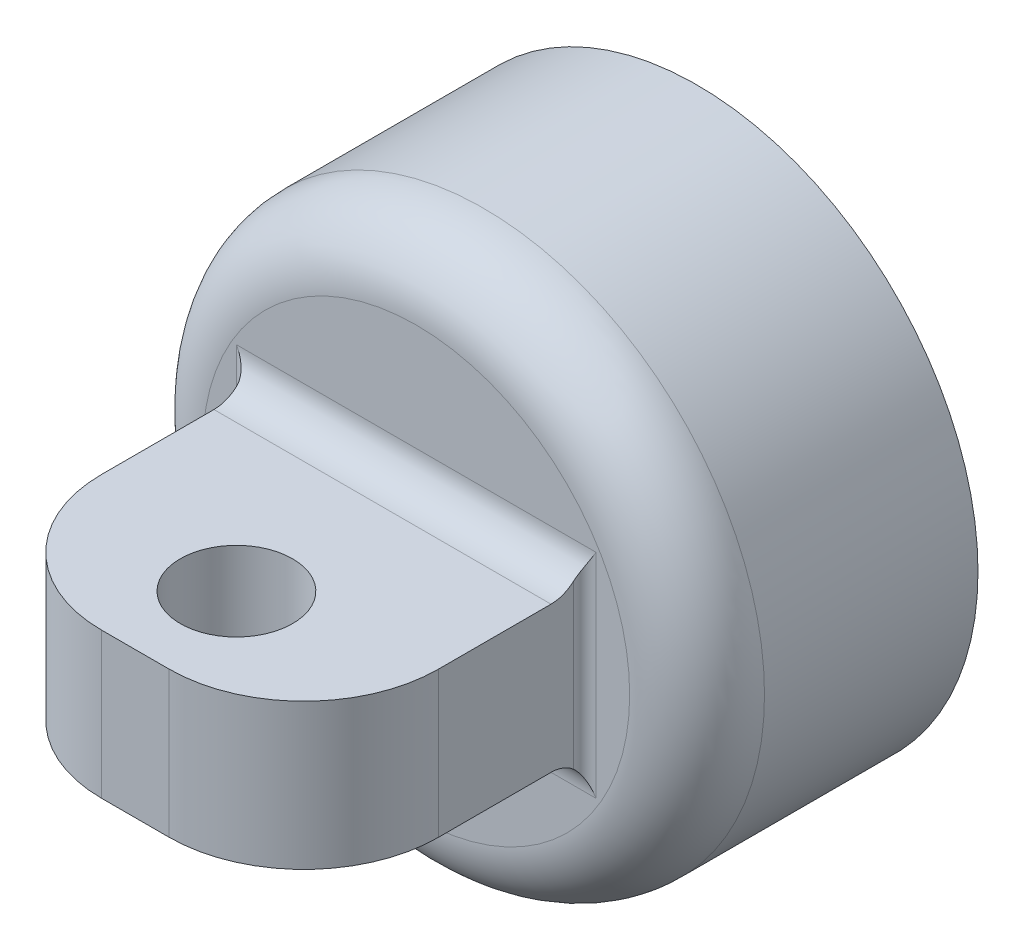
ISO-10303-21;
HEADER;
FILE_DESCRIPTION(('STEP AP214'),'2;1');
FILE_NAME('part.step','',(''),(''),'','','');
FILE_SCHEMA(('AUTOMOTIVE_DESIGN { 1 0 10303 214 1 1 1 1 }'));
ENDSEC;
DATA;
#1=APPLICATION_CONTEXT('core data for automotive mechanical design processes');
#2=APPLICATION_PROTOCOL_DEFINITION('international standard','automotive_design',2000,#1);
#3=PRODUCT_CONTEXT('',#1,'mechanical');
#4=PRODUCT('Part','Part','',(#3));
#5=PRODUCT_RELATED_PRODUCT_CATEGORY('part','',(#4));
#6=PRODUCT_DEFINITION_FORMATION('','',#4);
#7=PRODUCT_DEFINITION_CONTEXT('part definition',#1,'design');
#8=PRODUCT_DEFINITION('design','',#6,#7);
#9=PRODUCT_DEFINITION_SHAPE('','',#8);
#10=(LENGTH_UNIT() NAMED_UNIT(*) SI_UNIT(.MILLI.,.METRE.));
#11=(NAMED_UNIT(*) PLANE_ANGLE_UNIT() SI_UNIT($,.RADIAN.));
#12=(NAMED_UNIT(*) SI_UNIT($,.STERADIAN.) SOLID_ANGLE_UNIT());
#13=UNCERTAINTY_MEASURE_WITH_UNIT(LENGTH_MEASURE(1.E-05),#10,'distance_accuracy_value','');
#14=(GEOMETRIC_REPRESENTATION_CONTEXT(3) GLOBAL_UNCERTAINTY_ASSIGNED_CONTEXT((#13)) GLOBAL_UNIT_ASSIGNED_CONTEXT((#10,
#11,#12)) REPRESENTATION_CONTEXT('',''));
#15=CARTESIAN_POINT('',(0.,0.,0.));
#16=DIRECTION('',(0.,0.,1.));
#17=DIRECTION('',(1.,0.,0.));
#18=AXIS2_PLACEMENT_3D('',#15,#16,#17);
#19=CARTESIAN_POINT('',(0.,0.,25.));
#20=DIRECTION('',(0.,0.,-1.));
#21=DIRECTION('',(-1.,0.,0.));
#22=AXIS2_PLACEMENT_3D('',#19,#20,#21);
#23=CYLINDRICAL_SURFACE('',#22,25.);
#24=CARTESIAN_POINT('',(0.,0.,19.));
#25=DIRECTION('',(0.,0.,1.));
#26=DIRECTION('',(1.,0.,0.));
#27=AXIS2_PLACEMENT_3D('',#24,#25,#26);
#28=CIRCLE('',#27,25.);
#29=CARTESIAN_POINT('',(25.,0.,19.));
#30=VERTEX_POINT('',#29);
#31=EDGE_CURVE('E11',#30,#30,#28,.F.);
#32=ORIENTED_EDGE('',*,*,#31,.T.);
#33=EDGE_LOOP('',(#32));
#34=FACE_BOUND('',#33,.T.);
#35=CARTESIAN_POINT('',(0.,0.,0.));
#36=DIRECTION('',(0.,0.,1.));
#37=DIRECTION('',(1.,0.,0.));
#38=AXIS2_PLACEMENT_3D('',#35,#36,#37);
#39=CIRCLE('',#38,25.);
#40=CARTESIAN_POINT('',(25.,0.,0.));
#41=VERTEX_POINT('',#40);
#42=EDGE_CURVE('E156',#41,#41,#39,.T.);
#43=ORIENTED_EDGE('',*,*,#42,.T.);
#44=EDGE_LOOP('',(#43));
#45=FACE_BOUND('',#44,.T.);
#46=ADVANCED_FACE('F33',(#34,#45),#23,.T.);
#47=CARTESIAN_POINT('',(0.,0.,25.));
#48=DIRECTION('',(0.,0.,1.));
#49=DIRECTION('',(1.,0.,0.));
#50=AXIS2_PLACEMENT_3D('',#47,#48,#49);
#51=PLANE('',#50);
#52=CARTESIAN_POINT('',(0.,0.,25.));
#53=DIRECTION('',(0.,0.,1.));
#54=DIRECTION('',(1.,0.,0.));
#55=AXIS2_PLACEMENT_3D('',#52,#53,#54);
#56=CIRCLE('',#55,19.);
#57=CARTESIAN_POINT('',(19.,0.,25.));
#58=VERTEX_POINT('',#57);
#59=EDGE_CURVE('E41',#58,#58,#56,.T.);
#60=ORIENTED_EDGE('',*,*,#59,.T.);
#61=EDGE_LOOP('',(#60));
#62=FACE_BOUND('',#61,.T.);
#63=DIRECTION('',(0.,-1.,0.));
#64=VECTOR('',#63,1.);
#65=CARTESIAN_POINT('',(-16.,0.,25.));
#66=LINE('',#65,#64);
#67=CARTESIAN_POINT('',(-16.,-9.48210619073444,25.));
#68=VERTEX_POINT('',#67);
#69=CARTESIAN_POINT('',(-16.,9.48210619073444,25.));
#70=VERTEX_POINT('',#69);
#71=EDGE_CURVE('E169',#68,#70,#66,.F.);
#72=ORIENTED_EDGE('',*,*,#71,.T.);
#73=DIRECTION('',(-1.,0.,0.));
#74=VECTOR('',#73,1.);
#75=CARTESIAN_POINT('',(0.,9.48210619073444,25.));
#76=LINE('',#75,#74);
#77=CARTESIAN_POINT('',(16.,9.48210619073444,25.));
#78=VERTEX_POINT('',#77);
#79=EDGE_CURVE('E180',#70,#78,#76,.F.);
#80=ORIENTED_EDGE('',*,*,#79,.T.);
#81=DIRECTION('',(0.,1.,0.));
#82=VECTOR('',#81,1.);
#83=CARTESIAN_POINT('',(16.,0.,25.));
#84=LINE('',#83,#82);
#85=CARTESIAN_POINT('',(16.,-9.48210619073444,25.));
#86=VERTEX_POINT('',#85);
#87=EDGE_CURVE('E171',#78,#86,#84,.F.);
#88=ORIENTED_EDGE('',*,*,#87,.T.);
#89=DIRECTION('',(1.,0.,0.));
#90=VECTOR('',#89,1.);
#91=CARTESIAN_POINT('',(0.,-9.48210619073444,25.));
#92=LINE('',#91,#90);
#93=EDGE_CURVE('E177',#86,#68,#92,.F.);
#94=ORIENTED_EDGE('',*,*,#93,.T.);
#95=EDGE_LOOP('',(#72,#80,#88,#94));
#96=FACE_BOUND('',#95,.T.);
#97=ADVANCED_FACE('F231',(#62,#96),#51,.T.);
#98=CARTESIAN_POINT('',(0.,0.,0.));
#99=DIRECTION('',(0.,0.,1.));
#100=DIRECTION('',(1.,0.,0.));
#101=AXIS2_PLACEMENT_3D('',#98,#99,#100);
#102=PLANE('',#101);
#103=ORIENTED_EDGE('',*,*,#42,.F.);
#104=EDGE_LOOP('',(#103));
#105=FACE_BOUND('',#104,.T.);
#106=ADVANCED_FACE('F249',(#105),#102,.F.);
#107=CARTESIAN_POINT('',(15.,-6.48210619073444,50.));
#108=DIRECTION('',(-1.,0.,0.));
#109=DIRECTION('',(0.,0.,1.));
#110=AXIS2_PLACEMENT_3D('',#107,#108,#109);
#111=PLANE('',#110);
#112=DIRECTION('',(0.,0.,-1.));
#113=VECTOR('',#112,1.);
#114=CARTESIAN_POINT('',(15.,-6.48210619073444,50.));
#115=LINE('',#114,#113);
#116=CARTESIAN_POINT('',(15.,-6.48210619073444,38.));
#117=VERTEX_POINT('',#116);
#118=CARTESIAN_POINT('',(15.,-6.48210619073444,28.));
#119=VERTEX_POINT('',#118);
#120=EDGE_CURVE('E139',#117,#119,#115,.T.);
#121=ORIENTED_EDGE('',*,*,#120,.T.);
#122=CARTESIAN_POINT('',(15.,-9.48210619073444,28.));
#123=DIRECTION('',(-1.,0.,0.));
#124=DIRECTION('',(0.,0.,1.));
#125=AXIS2_PLACEMENT_3D('',#122,#123,#124);
#126=CIRCLE('',#125,3.);
#127=CARTESIAN_POINT('',(15.,-7.24603821323465,26.));
#128=VERTEX_POINT('',#127);
#129=EDGE_CURVE('E287',#119,#128,#126,.T.);
#130=ORIENTED_EDGE('',*,*,#129,.T.);
#131=DIRECTION('',(0.,1.,0.));
#132=VECTOR('',#131,1.);
#133=CARTESIAN_POINT('',(15.,-6.48210619073444,26.));
#134=LINE('',#133,#132);
#135=CARTESIAN_POINT('',(15.,7.24603821323465,26.));
#136=VERTEX_POINT('',#135);
#137=EDGE_CURVE('E56',#128,#136,#134,.T.);
#138=ORIENTED_EDGE('',*,*,#137,.T.);
#139=CARTESIAN_POINT('',(15.,9.48210619073444,28.));
#140=DIRECTION('',(-1.,0.,0.));
#141=DIRECTION('',(0.,0.,1.));
#142=AXIS2_PLACEMENT_3D('',#139,#140,#141);
#143=CIRCLE('',#142,3.);
#144=CARTESIAN_POINT('',(15.,6.48210619073444,28.));
#145=VERTEX_POINT('',#144);
#146=EDGE_CURVE('E285',#136,#145,#143,.T.);
#147=ORIENTED_EDGE('',*,*,#146,.T.);
#148=DIRECTION('',(0.,0.,-1.));
#149=VECTOR('',#148,1.);
#150=CARTESIAN_POINT('',(15.,6.48210619073444,50.));
#151=LINE('',#150,#149);
#152=CARTESIAN_POINT('',(15.,6.48210619073444,38.));
#153=VERTEX_POINT('',#152);
#154=EDGE_CURVE('E154',#153,#145,#151,.T.);
#155=ORIENTED_EDGE('',*,*,#154,.F.);
#156=DIRECTION('',(0.,1.,0.));
#157=VECTOR('',#156,1.);
#158=CARTESIAN_POINT('',(15.,-6.48210619073444,38.));
#159=LINE('',#158,#157);
#160=EDGE_CURVE('E116',#153,#117,#159,.F.);
#161=ORIENTED_EDGE('',*,*,#160,.T.);
#162=EDGE_LOOP('',(#121,#130,#138,#147,#155,#161));
#163=FACE_BOUND('',#162,.T.);
#164=ADVANCED_FACE('F288',(#163),#111,.F.);
#165=CARTESIAN_POINT('',(-15.,6.48210619073444,50.));
#166=DIRECTION('',(0.,-1.,0.));
#167=DIRECTION('',(0.,0.,-1.));
#168=AXIS2_PLACEMENT_3D('',#165,#166,#167);
#169=PLANE('',#168);
#170=CARTESIAN_POINT('',(0.,6.48210619073444,41.));
#171=DIRECTION('',(0.,-1.,0.));
#172=DIRECTION('',(0.,0.,-1.));
#173=AXIS2_PLACEMENT_3D('',#170,#171,#172);
#174=CIRCLE('',#173,5.);
#175=CARTESIAN_POINT('',(0.,6.48210619073445,36.));
#176=VERTEX_POINT('',#175);
#177=EDGE_CURVE('E137',#176,#176,#174,.F.);
#178=ORIENTED_EDGE('',*,*,#177,.F.);
#179=EDGE_LOOP('',(#178));
#180=FACE_BOUND('',#179,.T.);
#181=ORIENTED_EDGE('',*,*,#154,.T.);
#182=DIRECTION('',(-1.,0.,0.));
#183=VECTOR('',#182,1.);
#184=CARTESIAN_POINT('',(-15.,6.48210619073444,28.));
#185=LINE('',#184,#183);
#186=CARTESIAN_POINT('',(-15.,6.48210619073444,28.));
#187=VERTEX_POINT('',#186);
#188=EDGE_CURVE('E174',#145,#187,#185,.T.);
#189=ORIENTED_EDGE('',*,*,#188,.T.);
#190=DIRECTION('',(0.,0.,-1.));
#191=VECTOR('',#190,1.);
#192=CARTESIAN_POINT('',(-15.,6.48210619073444,50.));
#193=LINE('',#192,#191);
#194=CARTESIAN_POINT('',(-15.,6.48210619073444,38.));
#195=VERTEX_POINT('',#194);
#196=EDGE_CURVE('E151',#195,#187,#193,.T.);
#197=ORIENTED_EDGE('',*,*,#196,.F.);
#198=CARTESIAN_POINT('',(-3.,6.48210619073444,38.));
#199=DIRECTION('',(0.,-1.,0.));
#200=DIRECTION('',(0.,0.,-1.));
#201=AXIS2_PLACEMENT_3D('',#198,#199,#200);
#202=CIRCLE('',#201,12.);
#203=CARTESIAN_POINT('',(-3.,6.48210619073444,50.));
#204=VERTEX_POINT('',#203);
#205=EDGE_CURVE('E121',#195,#204,#202,.F.);
#206=ORIENTED_EDGE('',*,*,#205,.T.);
#207=DIRECTION('',(-1.,0.,0.));
#208=VECTOR('',#207,1.);
#209=CARTESIAN_POINT('',(-15.,6.48210619073444,50.));
#210=LINE('',#209,#208);
#211=CARTESIAN_POINT('',(2.99999999999999,6.48210619073444,50.));
#212=VERTEX_POINT('',#211);
#213=EDGE_CURVE('E128',#212,#204,#210,.T.);
#214=ORIENTED_EDGE('',*,*,#213,.F.);
#215=CARTESIAN_POINT('',(2.99999999999999,6.48210619073444,38.));
#216=DIRECTION('',(0.,-1.,0.));
#217=DIRECTION('',(0.,0.,-1.));
#218=AXIS2_PLACEMENT_3D('',#215,#216,#217);
#219=CIRCLE('',#218,12.);
#220=EDGE_CURVE('E111',#212,#153,#219,.F.);
#221=ORIENTED_EDGE('',*,*,#220,.T.);
#222=EDGE_LOOP('',(#181,#189,#197,#206,#214,#221));
#223=FACE_BOUND('',#222,.T.);
#224=ADVANCED_FACE('F134',(#180,#223),#169,.F.);
#225=CARTESIAN_POINT('',(-15.,-6.48210619073444,50.));
#226=DIRECTION('',(1.,0.,0.));
#227=DIRECTION('',(0.,0.,-1.));
#228=AXIS2_PLACEMENT_3D('',#225,#226,#227);
#229=PLANE('',#228);
#230=ORIENTED_EDGE('',*,*,#196,.T.);
#231=CARTESIAN_POINT('',(-15.,9.48210619073444,28.));
#232=DIRECTION('',(1.,0.,0.));
#233=DIRECTION('',(0.,0.,-1.));
#234=AXIS2_PLACEMENT_3D('',#231,#232,#233);
#235=CIRCLE('',#234,3.);
#236=CARTESIAN_POINT('',(-15.,7.24603821323465,26.));
#237=VERTEX_POINT('',#236);
#238=EDGE_CURVE('E186',#187,#237,#235,.T.);
#239=ORIENTED_EDGE('',*,*,#238,.T.);
#240=DIRECTION('',(0.,-1.,0.));
#241=VECTOR('',#240,1.);
#242=CARTESIAN_POINT('',(-15.,-6.48210619073444,26.));
#243=LINE('',#242,#241);
#244=CARTESIAN_POINT('',(-15.,-7.24603821323465,26.));
#245=VERTEX_POINT('',#244);
#246=EDGE_CURVE('E48',#237,#245,#243,.T.);
#247=ORIENTED_EDGE('',*,*,#246,.T.);
#248=CARTESIAN_POINT('',(-15.,-9.48210619073444,28.));
#249=DIRECTION('',(1.,0.,0.));
#250=DIRECTION('',(0.,0.,-1.));
#251=AXIS2_PLACEMENT_3D('',#248,#249,#250);
#252=CIRCLE('',#251,3.);
#253=CARTESIAN_POINT('',(-15.,-6.48210619073444,28.));
#254=VERTEX_POINT('',#253);
#255=EDGE_CURVE('E227',#245,#254,#252,.T.);
#256=ORIENTED_EDGE('',*,*,#255,.T.);
#257=DIRECTION('',(0.,0.,-1.));
#258=VECTOR('',#257,1.);
#259=CARTESIAN_POINT('',(-15.,-6.48210619073444,50.));
#260=LINE('',#259,#258);
#261=CARTESIAN_POINT('',(-15.,-6.48210619073444,38.));
#262=VERTEX_POINT('',#261);
#263=EDGE_CURVE('E148',#262,#254,#260,.T.);
#264=ORIENTED_EDGE('',*,*,#263,.F.);
#265=DIRECTION('',(0.,-1.,0.));
#266=VECTOR('',#265,1.);
#267=CARTESIAN_POINT('',(-15.,-6.48210619073444,38.));
#268=LINE('',#267,#266);
#269=EDGE_CURVE('E166',#262,#195,#268,.F.);
#270=ORIENTED_EDGE('',*,*,#269,.T.);
#271=EDGE_LOOP('',(#230,#239,#247,#256,#264,#270));
#272=FACE_BOUND('',#271,.T.);
#273=ADVANCED_FACE('F273',(#272),#229,.F.);
#274=CARTESIAN_POINT('',(-15.,-6.48210619073444,50.));
#275=DIRECTION('',(0.,1.,0.));
#276=DIRECTION('',(0.,0.,1.));
#277=AXIS2_PLACEMENT_3D('',#274,#275,#276);
#278=PLANE('',#277);
#279=CARTESIAN_POINT('',(0.,-6.48210619073444,41.));
#280=DIRECTION('',(0.,-1.,0.));
#281=DIRECTION('',(0.,0.,-1.));
#282=AXIS2_PLACEMENT_3D('',#279,#280,#281);
#283=CIRCLE('',#282,5.);
#284=CARTESIAN_POINT('',(0.,-6.48210619073444,36.));
#285=VERTEX_POINT('',#284);
#286=EDGE_CURVE('E142',#285,#285,#283,.T.);
#287=ORIENTED_EDGE('',*,*,#286,.F.);
#288=EDGE_LOOP('',(#287));
#289=FACE_BOUND('',#288,.T.);
#290=ORIENTED_EDGE('',*,*,#263,.T.);
#291=DIRECTION('',(1.,0.,0.));
#292=VECTOR('',#291,1.);
#293=CARTESIAN_POINT('',(-15.,-6.48210619073444,28.));
#294=LINE('',#293,#292);
#295=EDGE_CURVE('E183',#254,#119,#294,.T.);
#296=ORIENTED_EDGE('',*,*,#295,.T.);
#297=ORIENTED_EDGE('',*,*,#120,.F.);
#298=CARTESIAN_POINT('',(2.99999999999999,-6.48210619073444,38.));
#299=DIRECTION('',(0.,1.,0.));
#300=DIRECTION('',(0.,0.,1.));
#301=AXIS2_PLACEMENT_3D('',#298,#299,#300);
#302=CIRCLE('',#301,12.);
#303=CARTESIAN_POINT('',(2.99999999999999,-6.48210619073444,50.));
#304=VERTEX_POINT('',#303);
#305=EDGE_CURVE('E164',#117,#304,#302,.F.);
#306=ORIENTED_EDGE('',*,*,#305,.T.);
#307=DIRECTION('',(1.,0.,0.));
#308=VECTOR('',#307,1.);
#309=CARTESIAN_POINT('',(-15.,-6.48210619073444,50.));
#310=LINE('',#309,#308);
#311=CARTESIAN_POINT('',(-3.,-6.48210619073444,50.));
#312=VERTEX_POINT('',#311);
#313=EDGE_CURVE('E131',#312,#304,#310,.T.);
#314=ORIENTED_EDGE('',*,*,#313,.F.);
#315=CARTESIAN_POINT('',(-3.,-6.48210619073444,38.));
#316=DIRECTION('',(0.,1.,0.));
#317=DIRECTION('',(0.,0.,1.));
#318=AXIS2_PLACEMENT_3D('',#315,#316,#317);
#319=CIRCLE('',#318,12.);
#320=EDGE_CURVE('E162',#312,#262,#319,.F.);
#321=ORIENTED_EDGE('',*,*,#320,.T.);
#322=EDGE_LOOP('',(#290,#296,#297,#306,#314,#321));
#323=FACE_BOUND('',#322,.T.);
#324=ADVANCED_FACE('F283',(#289,#323),#278,.F.);
#325=CARTESIAN_POINT('',(0.,0.,50.));
#326=DIRECTION('',(0.,0.,-1.));
#327=DIRECTION('',(-1.,0.,0.));
#328=AXIS2_PLACEMENT_3D('',#325,#326,#327);
#329=PLANE('',#328);
#330=ORIENTED_EDGE('',*,*,#313,.T.);
#331=DIRECTION('',(0.,1.,0.));
#332=VECTOR('',#331,1.);
#333=CARTESIAN_POINT('',(2.99999999999999,0.,50.));
#334=LINE('',#333,#332);
#335=EDGE_CURVE('E115',#304,#212,#334,.T.);
#336=ORIENTED_EDGE('',*,*,#335,.T.);
#337=ORIENTED_EDGE('',*,*,#213,.T.);
#338=DIRECTION('',(0.,-1.,0.));
#339=VECTOR('',#338,1.);
#340=CARTESIAN_POINT('',(-3.,0.,50.));
#341=LINE('',#340,#339);
#342=EDGE_CURVE('E132',#204,#312,#341,.T.);
#343=ORIENTED_EDGE('',*,*,#342,.T.);
#344=EDGE_LOOP('',(#330,#336,#337,#343));
#345=FACE_BOUND('',#344,.T.);
#346=ADVANCED_FACE('F126',(#345),#329,.F.);
#347=CARTESIAN_POINT('',(2.99999999999999,0.,38.));
#348=DIRECTION('',(0.,1.,0.));
#349=DIRECTION('',(0.,0.,1.));
#350=AXIS2_PLACEMENT_3D('',#347,#348,#349);
#351=CYLINDRICAL_SURFACE('',#350,12.);
#352=ORIENTED_EDGE('',*,*,#305,.F.);
#353=ORIENTED_EDGE('',*,*,#160,.F.);
#354=ORIENTED_EDGE('',*,*,#220,.F.);
#355=ORIENTED_EDGE('',*,*,#335,.F.);
#356=EDGE_LOOP('',(#352,#353,#354,#355));
#357=FACE_BOUND('',#356,.T.);
#358=ADVANCED_FACE('F114',(#357),#351,.T.);
#359=CARTESIAN_POINT('',(-3.,0.,38.));
#360=DIRECTION('',(0.,-1.,0.));
#361=DIRECTION('',(0.,0.,-1.));
#362=AXIS2_PLACEMENT_3D('',#359,#360,#361);
#363=CYLINDRICAL_SURFACE('',#362,12.);
#364=ORIENTED_EDGE('',*,*,#205,.F.);
#365=ORIENTED_EDGE('',*,*,#269,.F.);
#366=ORIENTED_EDGE('',*,*,#320,.F.);
#367=ORIENTED_EDGE('',*,*,#342,.F.);
#368=EDGE_LOOP('',(#364,#365,#366,#367));
#369=FACE_BOUND('',#368,.T.);
#370=ADVANCED_FACE('F256',(#369),#363,.T.);
#371=CARTESIAN_POINT('',(16.,-6.48210619073444,26.));
#372=DIRECTION('',(0.,1.,0.));
#373=DIRECTION('',(0.,0.,1.));
#374=AXIS2_PLACEMENT_3D('',#371,#372,#373);
#375=CYLINDRICAL_SURFACE('',#374,1.);
#376=ORIENTED_EDGE('',*,*,#137,.F.);
#377=CARTESIAN_POINT('',(15.,-7.24603821323465,26.));
#378=CARTESIAN_POINT('',(15.0000045555107,-7.27434889702691,25.9683421227827));
#379=CARTESIAN_POINT('',(15.001502630521,-7.30331760909909,25.937312555623));
#380=CARTESIAN_POINT('',(15.0071669851848,-7.36237877452759,25.8766678274943));
#381=CARTESIAN_POINT('',(15.0113298709753,-7.39246975274207,25.847050918864));
#382=CARTESIAN_POINT('',(15.0272642318095,-7.48378604338502,25.7608737257337));
#383=CARTESIAN_POINT('',(15.0424913092058,-7.54648735570941,25.7065051528933));
#384=CARTESIAN_POINT('',(15.092437017818,-7.71696168919703,25.5704386427709));
#385=CARTESIAN_POINT('',(15.1333888247122,-7.82728024523833,25.4942553669028));
#386=CARTESIAN_POINT('',(15.2281873059139,-8.05333382785261,25.3587627220768));
#387=CARTESIAN_POINT('',(15.282113178334,-8.16909846481993,25.2995620859109));
#388=CARTESIAN_POINT('',(15.3814590733246,-8.36982102402024,25.2123310760532));
#389=CARTESIAN_POINT('',(15.4248612514737,-8.45405772329879,25.180233319111));
#390=CARTESIAN_POINT('',(15.5146643361153,-8.62361907158699,25.1240679978524));
#391=CARTESIAN_POINT('',(15.5610667415805,-8.70894424706363,25.1000044851913));
#392=CARTESIAN_POINT('',(15.70303658057,-8.96554414876069,25.039597092353));
#393=CARTESIAN_POINT('',(15.8016660196142,-9.138024551225,25.0147897665438));
#394=CARTESIAN_POINT('',(15.9321423018878,-9.36456308350194,25.0018159537015));
#395=CARTESIAN_POINT('',(15.9633277351855,-9.4185874096058,25.0001858337173));
#396=CARTESIAN_POINT('',(15.996348494144,-9.47578160523165,25.0000050019085));
#397=CARTESIAN_POINT('',(15.9981742368467,-9.47894388454412,25.0000000021803));
#398=CARTESIAN_POINT('',(16.,-9.48210619073444,25.));
#399=B_SPLINE_CURVE_WITH_KNOTS('',3,(#377,#378,#379,#380,#381,#382,#383,#384,#385,#386,#387,
#388,#389,#390,#391,#392,#393,#394,#395,#396,#397,#398),.UNSPECIFIED.,.F.,.F.,(4,2,2,2,2,2,2,2,
2,2,4),(0.,0.127328124372211,0.254494407314628,0.506902758847988,0.925154347494109,
1.34602692875661,1.64578712718784,1.94569826663478,2.54344782717992,2.7306215879237,
2.74157604934411),.UNSPECIFIED.);
#400=EDGE_CURVE('E216',#128,#86,#399,.T.);
#401=ORIENTED_EDGE('',*,*,#400,.T.);
#402=ORIENTED_EDGE('',*,*,#87,.F.);
#403=CARTESIAN_POINT('',(15.,7.24603821323465,26.));
#404=CARTESIAN_POINT('',(15.0000045555107,7.27434889702691,25.9683421227827));
#405=CARTESIAN_POINT('',(15.001502630521,7.30331760909908,25.937312555623));
#406=CARTESIAN_POINT('',(15.0071669851848,7.36237877452759,25.8766678274943));
#407=CARTESIAN_POINT('',(15.0113298709753,7.39246975274207,25.847050918864));
#408=CARTESIAN_POINT('',(15.0272642318095,7.48378604338502,25.7608737257337));
#409=CARTESIAN_POINT('',(15.0424913092058,7.54648735570941,25.7065051528933));
#410=CARTESIAN_POINT('',(15.092437017818,7.71696168919703,25.5704386427709));
#411=CARTESIAN_POINT('',(15.1333888247122,7.82728024523833,25.4942553669028));
#412=CARTESIAN_POINT('',(15.2281873059139,8.05333382785261,25.3587627220768));
#413=CARTESIAN_POINT('',(15.282113178334,8.16909846481993,25.2995620859109));
#414=CARTESIAN_POINT('',(15.3814590733246,8.36982102402023,25.2123310760532));
#415=CARTESIAN_POINT('',(15.4248612514737,8.45405772329878,25.180233319111));
#416=CARTESIAN_POINT('',(15.5146643361153,8.62361907158699,25.1240679978524));
#417=CARTESIAN_POINT('',(15.5610667415805,8.70894424706364,25.1000044851913));
#418=CARTESIAN_POINT('',(15.7030365805701,8.96554414876067,25.039597092353));
#419=CARTESIAN_POINT('',(15.8016660196144,9.13802455122488,25.0147897665438));
#420=CARTESIAN_POINT('',(15.9321423018877,9.36456308350197,25.0018159537015));
#421=CARTESIAN_POINT('',(15.9633277351853,9.4185874096059,25.0001858337173));
#422=CARTESIAN_POINT('',(15.996348494144,9.47578160523166,25.0000050019085));
#423=CARTESIAN_POINT('',(15.9981742368467,9.47894388454413,25.0000000021803));
#424=CARTESIAN_POINT('',(16.,9.48210619073444,25.));
#425=B_SPLINE_CURVE_WITH_KNOTS('',3,(#403,#404,#405,#406,#407,#408,#409,#410,#411,#412,#413,
#414,#415,#416,#417,#418,#419,#420,#421,#422,#423,#424),.UNSPECIFIED.,.F.,.F.,(4,2,2,2,2,2,2,2,
2,2,4),(0.,0.12732812437221,0.254494407314624,0.506902758847988,0.925154347494114,
1.34602692875661,1.64578712718784,1.94569826663478,2.54344782717992,2.7306215879237,
2.74157604934411),.UNSPECIFIED.);
#426=EDGE_CURVE('E196',#78,#136,#425,.F.);
#427=ORIENTED_EDGE('',*,*,#426,.T.);
#428=EDGE_LOOP('',(#376,#401,#402,#427));
#429=FACE_BOUND('',#428,.T.);
#430=ADVANCED_FACE('F258',(#429),#375,.F.);
#431=CARTESIAN_POINT('',(-16.,-6.48210619073444,26.));
#432=DIRECTION('',(0.,-1.,0.));
#433=DIRECTION('',(0.,0.,-1.));
#434=AXIS2_PLACEMENT_3D('',#431,#432,#433);
#435=CYLINDRICAL_SURFACE('',#434,1.);
#436=ORIENTED_EDGE('',*,*,#246,.F.);
#437=CARTESIAN_POINT('',(-15.,7.24603821323465,26.));
#438=CARTESIAN_POINT('',(-15.0000045555107,7.27434889702691,25.9683421227827));
#439=CARTESIAN_POINT('',(-15.001502630521,7.30331760909909,25.937312555623));
#440=CARTESIAN_POINT('',(-15.0071669851848,7.36237877452759,25.8766678274943));
#441=CARTESIAN_POINT('',(-15.0113298709753,7.39246975274207,25.847050918864));
#442=CARTESIAN_POINT('',(-15.0272642318095,7.48378604338502,25.7608737257337));
#443=CARTESIAN_POINT('',(-15.0424913092058,7.54648735570941,25.7065051528933));
#444=CARTESIAN_POINT('',(-15.092437017818,7.71696168919703,25.5704386427709));
#445=CARTESIAN_POINT('',(-15.1333888247123,7.82728024523833,25.4942553669028));
#446=CARTESIAN_POINT('',(-15.2281873059139,8.05333382785261,25.3587627220768));
#447=CARTESIAN_POINT('',(-15.282113178334,8.16909846481993,25.2995620859109));
#448=CARTESIAN_POINT('',(-15.3814590733246,8.36982102402024,25.2123310760532));
#449=CARTESIAN_POINT('',(-15.4248612514737,8.45405772329879,25.180233319111));
#450=CARTESIAN_POINT('',(-15.5146643361153,8.62361907158699,25.1240679978524));
#451=CARTESIAN_POINT('',(-15.5610667415805,8.70894424706363,25.1000044851913));
#452=CARTESIAN_POINT('',(-15.70303658057,8.96554414876069,25.039597092353));
#453=CARTESIAN_POINT('',(-15.8016660196142,9.138024551225,25.0147897665438));
#454=CARTESIAN_POINT('',(-15.9321423018878,9.36456308350194,25.0018159537015));
#455=CARTESIAN_POINT('',(-15.9633277351855,9.4185874096058,25.0001858337173));
#456=CARTESIAN_POINT('',(-15.9963484941441,9.47578160523165,25.0000050019085));
#457=CARTESIAN_POINT('',(-15.9981742368467,9.47894388454412,25.0000000021803));
#458=CARTESIAN_POINT('',(-16.,9.48210619073444,25.));
#459=B_SPLINE_CURVE_WITH_KNOTS('',3,(#437,#438,#439,#440,#441,#442,#443,#444,#445,#446,#447,
#448,#449,#450,#451,#452,#453,#454,#455,#456,#457,#458),.UNSPECIFIED.,.F.,.F.,(4,2,2,2,2,2,2,2,
2,2,4),(0.,0.127328124372211,0.254494407314628,0.506902758847988,0.925154347494109,
1.34602692875661,1.64578712718784,1.94569826663478,2.54344782717992,2.7306215879237,
2.74157604934411),.UNSPECIFIED.);
#460=EDGE_CURVE('E188',#237,#70,#459,.T.);
#461=ORIENTED_EDGE('',*,*,#460,.T.);
#462=ORIENTED_EDGE('',*,*,#71,.F.);
#463=CARTESIAN_POINT('',(-15.,-7.24603821323465,26.));
#464=CARTESIAN_POINT('',(-15.0000045555107,-7.27434889702691,25.9683421227827));
#465=CARTESIAN_POINT('',(-15.001502630521,-7.30331760909908,25.937312555623));
#466=CARTESIAN_POINT('',(-15.0071669851848,-7.36237877452759,25.8766678274943));
#467=CARTESIAN_POINT('',(-15.0113298709753,-7.39246975274207,25.847050918864));
#468=CARTESIAN_POINT('',(-15.0272642318095,-7.48378604338502,25.7608737257337));
#469=CARTESIAN_POINT('',(-15.0424913092058,-7.54648735570941,25.7065051528933));
#470=CARTESIAN_POINT('',(-15.092437017818,-7.71696168919703,25.5704386427709));
#471=CARTESIAN_POINT('',(-15.1333888247123,-7.82728024523833,25.4942553669028));
#472=CARTESIAN_POINT('',(-15.2281873059139,-8.05333382785261,25.3587627220768));
#473=CARTESIAN_POINT('',(-15.282113178334,-8.16909846481993,25.2995620859109));
#474=CARTESIAN_POINT('',(-15.3814590733246,-8.36982102402023,25.2123310760532));
#475=CARTESIAN_POINT('',(-15.4248612514737,-8.45405772329878,25.180233319111));
#476=CARTESIAN_POINT('',(-15.5146643361153,-8.62361907158699,25.1240679978524));
#477=CARTESIAN_POINT('',(-15.5610667415805,-8.70894424706364,25.1000044851913));
#478=CARTESIAN_POINT('',(-15.7030365805701,-8.96554414876067,25.039597092353));
#479=CARTESIAN_POINT('',(-15.8016660196144,-9.13802455122488,25.0147897665438));
#480=CARTESIAN_POINT('',(-15.9321423018877,-9.36456308350197,25.0018159537015));
#481=CARTESIAN_POINT('',(-15.9633277351853,-9.4185874096059,25.0001858337173));
#482=CARTESIAN_POINT('',(-15.996348494144,-9.47578160523166,25.0000050019085));
#483=CARTESIAN_POINT('',(-15.9981742368467,-9.47894388454413,25.0000000021803));
#484=CARTESIAN_POINT('',(-16.,-9.48210619073444,25.));
#485=B_SPLINE_CURVE_WITH_KNOTS('',3,(#463,#464,#465,#466,#467,#468,#469,#470,#471,#472,#473,
#474,#475,#476,#477,#478,#479,#480,#481,#482,#483,#484),.UNSPECIFIED.,.F.,.F.,(4,2,2,2,2,2,2,2,
2,2,4),(0.,0.12732812437221,0.254494407314624,0.506902758847988,0.925154347494114,
1.34602692875661,1.64578712718784,1.94569826663478,2.54344782717992,2.7306215879237,
2.74157604934411),.UNSPECIFIED.);
#486=EDGE_CURVE('E222',#68,#245,#485,.F.);
#487=ORIENTED_EDGE('',*,*,#486,.T.);
#488=EDGE_LOOP('',(#436,#461,#462,#487));
#489=FACE_BOUND('',#488,.T.);
#490=ADVANCED_FACE('F202',(#489),#435,.F.);
#491=CARTESIAN_POINT('',(-15.,9.48210619073444,28.));
#492=DIRECTION('',(-1.,0.,0.));
#493=DIRECTION('',(0.,0.,1.));
#494=AXIS2_PLACEMENT_3D('',#491,#492,#493);
#495=CYLINDRICAL_SURFACE('',#494,3.);
#496=ORIENTED_EDGE('',*,*,#426,.F.);
#497=ORIENTED_EDGE('',*,*,#79,.F.);
#498=ORIENTED_EDGE('',*,*,#460,.F.);
#499=ORIENTED_EDGE('',*,*,#238,.F.);
#500=ORIENTED_EDGE('',*,*,#188,.F.);
#501=ORIENTED_EDGE('',*,*,#146,.F.);
#502=EDGE_LOOP('',(#496,#497,#498,#499,#500,#501));
#503=FACE_BOUND('',#502,.T.);
#504=ADVANCED_FACE('F204',(#503),#495,.F.);
#505=CARTESIAN_POINT('',(-15.,-9.48210619073444,28.));
#506=DIRECTION('',(1.,0.,0.));
#507=DIRECTION('',(0.,0.,-1.));
#508=AXIS2_PLACEMENT_3D('',#505,#506,#507);
#509=CYLINDRICAL_SURFACE('',#508,3.);
#510=ORIENTED_EDGE('',*,*,#486,.F.);
#511=ORIENTED_EDGE('',*,*,#93,.F.);
#512=ORIENTED_EDGE('',*,*,#400,.F.);
#513=ORIENTED_EDGE('',*,*,#129,.F.);
#514=ORIENTED_EDGE('',*,*,#295,.F.);
#515=ORIENTED_EDGE('',*,*,#255,.F.);
#516=EDGE_LOOP('',(#510,#511,#512,#513,#514,#515));
#517=FACE_BOUND('',#516,.T.);
#518=ADVANCED_FACE('F207',(#517),#509,.F.);
#519=CARTESIAN_POINT('',(0.,20.6242418144654,41.));
#520=DIRECTION('',(0.,-1.,0.));
#521=DIRECTION('',(0.,0.,-1.));
#522=AXIS2_PLACEMENT_3D('',#519,#520,#521);
#523=CYLINDRICAL_SURFACE('',#522,5.);
#524=CARTESIAN_POINT('',(0.,6.48210619073445,36.));
#525=CARTESIAN_POINT('',(0.,6.34706231176081,36.));
#526=CARTESIAN_POINT('',(0.,6.21201843278718,36.));
#527=CARTESIAN_POINT('',(0.,5.94193067483991,36.));
#528=CARTESIAN_POINT('',(0.,5.80688679586627,36.));
#529=CARTESIAN_POINT('',(0.,5.53679903791901,36.));
#530=CARTESIAN_POINT('',(0.,5.40175515894537,36.));
#531=CARTESIAN_POINT('',(0.,5.1316674009981,36.));
#532=CARTESIAN_POINT('',(0.,4.99662352202447,36.));
#533=CARTESIAN_POINT('',(0.,4.7265357640772,36.));
#534=CARTESIAN_POINT('',(0.,4.59149188510357,36.));
#535=CARTESIAN_POINT('',(0.,4.3214041271563,36.));
#536=CARTESIAN_POINT('',(0.,4.18636024818267,36.));
#537=CARTESIAN_POINT('',(0.,3.9162724902354,36.));
#538=CARTESIAN_POINT('',(0.,3.78122861126176,36.));
#539=CARTESIAN_POINT('',(0.,3.51114085331449,36.));
#540=CARTESIAN_POINT('',(0.,3.37609697434086,36.));
#541=CARTESIAN_POINT('',(0.,3.10600921639359,36.));
#542=CARTESIAN_POINT('',(0.,2.97096533741996,36.));
#543=CARTESIAN_POINT('',(0.,2.70087757947269,36.));
#544=CARTESIAN_POINT('',(0.,2.56583370049905,36.));
#545=CARTESIAN_POINT('',(0.,2.29574594255178,36.));
#546=CARTESIAN_POINT('',(0.,2.16070206357815,36.));
#547=CARTESIAN_POINT('',(0.,1.89061430563088,36.));
#548=CARTESIAN_POINT('',(0.,1.75557042665725,36.));
#549=CARTESIAN_POINT('',(0.,1.48548266870998,36.));
#550=CARTESIAN_POINT('',(0.,1.35043878973635,36.));
#551=CARTESIAN_POINT('',(0.,1.08035103178908,36.));
#552=CARTESIAN_POINT('',(0.,0.945307152815444,36.));
#553=CARTESIAN_POINT('',(0.,0.675219394868174,36.));
#554=CARTESIAN_POINT('',(0.,0.540175515894539,36.));
#555=CARTESIAN_POINT('',(0.,0.270087757947271,36.));
#556=CARTESIAN_POINT('',(0.,0.135043878973637,36.));
#557=CARTESIAN_POINT('',(0.,-0.13504387897363,36.));
#558=CARTESIAN_POINT('',(0.,-0.270087757947264,36.));
#559=CARTESIAN_POINT('',(0.,-0.540175515894532,36.));
#560=CARTESIAN_POINT('',(0.,-0.675219394868167,36.));
#561=CARTESIAN_POINT('',(0.,-0.945307152815437,36.));
#562=CARTESIAN_POINT('',(0.,-1.08035103178907,36.));
#563=CARTESIAN_POINT('',(0.,-1.35043878973634,36.));
#564=CARTESIAN_POINT('',(0.,-1.48548266870997,36.));
#565=CARTESIAN_POINT('',(0.,-1.75557042665724,36.));
#566=CARTESIAN_POINT('',(0.,-1.89061430563087,36.));
#567=CARTESIAN_POINT('',(0.,-2.16070206357814,36.));
#568=CARTESIAN_POINT('',(0.,-2.29574594255178,36.));
#569=CARTESIAN_POINT('',(0.,-2.56583370049905,36.));
#570=CARTESIAN_POINT('',(0.,-2.70087757947268,36.));
#571=CARTESIAN_POINT('',(0.,-2.97096533741995,36.));
#572=CARTESIAN_POINT('',(0.,-3.10600921639358,36.));
#573=CARTESIAN_POINT('',(0.,-3.37609697434085,36.));
#574=CARTESIAN_POINT('',(0.,-3.51114085331449,36.));
#575=CARTESIAN_POINT('',(0.,-3.78122861126175,36.));
#576=CARTESIAN_POINT('',(0.,-3.91627249023539,36.));
#577=CARTESIAN_POINT('',(0.,-4.18636024818266,36.));
#578=CARTESIAN_POINT('',(0.,-4.32140412715629,36.));
#579=CARTESIAN_POINT('',(0.,-4.59149188510356,36.));
#580=CARTESIAN_POINT('',(0.,-4.7265357640772,36.));
#581=CARTESIAN_POINT('',(0.,-4.99662352202446,36.));
#582=CARTESIAN_POINT('',(0.,-5.1316674009981,36.));
#583=CARTESIAN_POINT('',(0.,-5.40175515894536,36.));
#584=CARTESIAN_POINT('',(0.,-5.536799037919,36.));
#585=CARTESIAN_POINT('',(0.,-5.80688679586627,36.));
#586=CARTESIAN_POINT('',(0.,-5.9419306748399,36.));
#587=CARTESIAN_POINT('',(0.,-6.21201843278717,36.));
#588=CARTESIAN_POINT('',(0.,-6.34706231176081,36.));
#589=CARTESIAN_POINT('',(0.,-6.48210619073444,36.));
#590=B_SPLINE_CURVE_WITH_KNOTS('',3,(#524,#525,#526,#527,#528,#529,#530,#531,#532,#533,#534,
#535,#536,#537,#538,#539,#540,#541,#542,#543,#544,#545,#546,#547,#548,#549,#550,#551,#552,#553,
#554,#555,#556,#557,#558,#559,#560,#561,#562,#563,#564,#565,#566,#567,#568,#569,#570,#571,#572,
#573,#574,#575,#576,#577,#578,#579,#580,#581,#582,#583,#584,#585,#586,#587,#588,#589),
.UNSPECIFIED.,.F.,.F.,(4,2,2,2,2,2,2,2,2,2,2,2,2,2,2,2,2,2,2,2,2,2,2,2,2,2,2,2,2,2,2,2,4),(0.,
0.405131636920903,0.810263273841805,1.21539491076271,1.62052654768361,2.02565818460451,
2.43078982152541,2.83592145844632,3.24105309536722,3.64618473228812,4.05131636920903,
4.45644800612993,4.86157964305083,5.26671127997173,5.67184291689264,6.07697455381354,
6.48210619073444,6.88723782765534,7.29236946457625,7.69750110149715,8.10263273841805,
8.50776437533895,8.91289601225986,9.31802764918076,9.72315928610166,10.1282909230226,
10.5334225599435,10.9385541968644,11.3436858337853,11.7488174707062,12.1539491076271,
12.559080744548,12.9642123814689),.UNSPECIFIED.);
#591=EDGE_CURVE('BSEAM212',#176,#285,#590,.T.);
#592=ORIENTED_EDGE('',*,*,#177,.T.);
#593=ORIENTED_EDGE('',*,*,#286,.T.);
#594=ORIENTED_EDGE('',*,*,#591,.T.);
#595=ORIENTED_EDGE('',*,*,#591,.F.);
#596=EDGE_LOOP('',(#592,#594,#593,#595));
#597=FACE_BOUND('',#596,.T.);
#598=ADVANCED_FACE('F212',(#597),#523,.F.);
#599=CARTESIAN_POINT('',(0.,0.,19.));
#600=DIRECTION('',(0.,0.,1.));
#601=DIRECTION('',(1.,0.,0.));
#602=AXIS2_PLACEMENT_3D('',#599,#600,#601);
#603=TOROIDAL_SURFACE('',#602,19.,6.);
#604=ORIENTED_EDGE('',*,*,#31,.F.);
#605=EDGE_LOOP('',(#604));
#606=FACE_BOUND('',#605,.T.);
#607=ORIENTED_EDGE('',*,*,#59,.F.);
#608=EDGE_LOOP('',(#607));
#609=FACE_BOUND('',#608,.T.);
#610=ADVANCED_FACE('F35',(#606,#609),#603,.T.);
#611=CLOSED_SHELL('',(#46,#97,#106,#164,#224,#273,#324,#346,#358,#370,#430,#490,#504,#518,#598,#610));
#612=MANIFOLD_SOLID_BREP('B2',#611);
#613=ADVANCED_BREP_SHAPE_REPRESENTATION('',(#18,#612),#14);
#614=SHAPE_DEFINITION_REPRESENTATION(#9,#613);
ENDSEC;
END-ISO-10303-21;
